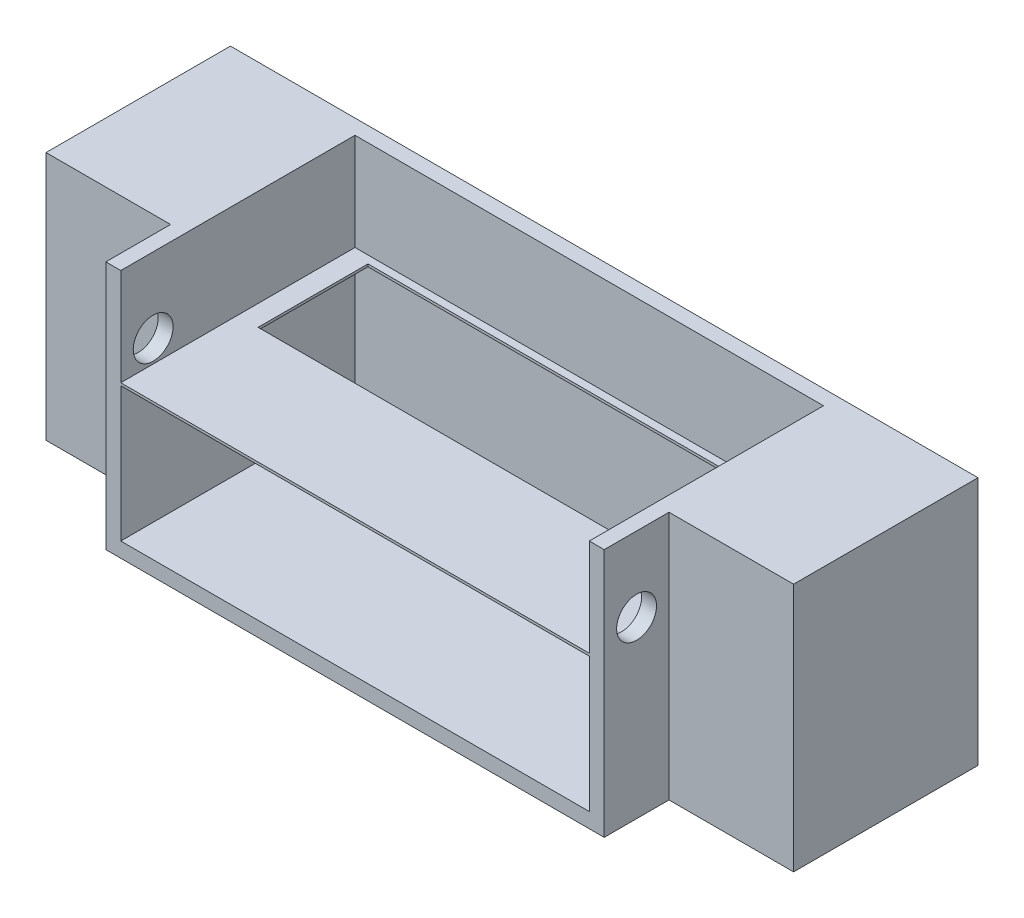
ISO-10303-21;
HEADER;
FILE_DESCRIPTION(('STEP AP214'),'2;1');
FILE_NAME('part.step','',(''),(''),'','','');
FILE_SCHEMA(('AUTOMOTIVE_DESIGN { 1 0 10303 214 1 1 1 1 }'));
ENDSEC;
DATA;
#1=APPLICATION_CONTEXT('core data for automotive mechanical design processes');
#2=APPLICATION_PROTOCOL_DEFINITION('international standard','automotive_design',2000,#1);
#3=PRODUCT_CONTEXT('',#1,'mechanical');
#4=PRODUCT('Part','Part','',(#3));
#5=PRODUCT_RELATED_PRODUCT_CATEGORY('part','',(#4));
#6=PRODUCT_DEFINITION_FORMATION('','',#4);
#7=PRODUCT_DEFINITION_CONTEXT('part definition',#1,'design');
#8=PRODUCT_DEFINITION('design','',#6,#7);
#9=PRODUCT_DEFINITION_SHAPE('','',#8);
#10=(LENGTH_UNIT() NAMED_UNIT(*) SI_UNIT(.MILLI.,.METRE.));
#11=(NAMED_UNIT(*) PLANE_ANGLE_UNIT() SI_UNIT($,.RADIAN.));
#12=(NAMED_UNIT(*) SI_UNIT($,.STERADIAN.) SOLID_ANGLE_UNIT());
#13=UNCERTAINTY_MEASURE_WITH_UNIT(LENGTH_MEASURE(1.E-05),#10,'distance_accuracy_value','');
#14=(GEOMETRIC_REPRESENTATION_CONTEXT(3) GLOBAL_UNCERTAINTY_ASSIGNED_CONTEXT((#13)) GLOBAL_UNIT_ASSIGNED_CONTEXT((#10,
#11,#12)) REPRESENTATION_CONTEXT('',''));
#15=CARTESIAN_POINT('',(0.,0.,0.));
#16=DIRECTION('',(0.,0.,1.));
#17=DIRECTION('',(1.,0.,0.));
#18=AXIS2_PLACEMENT_3D('',#15,#16,#17);
#19=CARTESIAN_POINT('',(-47.,-17.,0.));
#20=DIRECTION('',(-1.,0.,0.));
#21=DIRECTION('',(0.,-1.,0.));
#22=AXIS2_PLACEMENT_3D('',#19,#20,#21);
#23=PLANE('',#22);
#24=CARTESIAN_POINT('',(-47.,15.,-6.5));
#25=DIRECTION('',(-1.,0.,0.));
#26=DIRECTION('',(0.,-1.,0.));
#27=AXIS2_PLACEMENT_3D('',#24,#25,#26);
#28=CIRCLE('',#27,4.);
#29=CARTESIAN_POINT('',(-47.,11.,-6.5));
#30=VERTEX_POINT('',#29);
#31=EDGE_CURVE('E269',#30,#30,#28,.T.);
#32=ORIENTED_EDGE('',*,*,#31,.T.);
#33=EDGE_LOOP('',(#32));
#34=FACE_BOUND('',#33,.T.);
#35=DIRECTION('',(0.,1.,0.));
#36=VECTOR('',#35,1.);
#37=CARTESIAN_POINT('',(-47.,-17.,0.));
#38=LINE('',#37,#36);
#39=CARTESIAN_POINT('',(-47.,10.5,0.));
#40=VERTEX_POINT('',#39);
#41=CARTESIAN_POINT('',(-47.,30.,0.));
#42=VERTEX_POINT('',#41);
#43=EDGE_CURVE('E313',#40,#42,#38,.T.);
#44=ORIENTED_EDGE('',*,*,#43,.F.);
#45=DIRECTION('',(0.,0.,1.));
#46=VECTOR('',#45,1.);
#47=CARTESIAN_POINT('',(-47.,10.5,-500000.));
#48=LINE('',#47,#46);
#49=CARTESIAN_POINT('',(-47.,10.5,-47.));
#50=VERTEX_POINT('',#49);
#51=EDGE_CURVE('E213',#50,#40,#48,.T.);
#52=ORIENTED_EDGE('',*,*,#51,.F.);
#53=DIRECTION('',(0.,1.,0.));
#54=VECTOR('',#53,1.);
#55=CARTESIAN_POINT('',(-47.,-17.,-47.));
#56=LINE('',#55,#54);
#57=CARTESIAN_POINT('',(-47.,30.,-47.));
#58=VERTEX_POINT('',#57);
#59=EDGE_CURVE('E318',#50,#58,#56,.T.);
#60=ORIENTED_EDGE('',*,*,#59,.T.);
#61=DIRECTION('',(0.,0.,-1.));
#62=VECTOR('',#61,1.);
#63=CARTESIAN_POINT('',(-47.,30.,0.));
#64=LINE('',#63,#62);
#65=EDGE_CURVE('E233',#42,#58,#64,.T.);
#66=ORIENTED_EDGE('',*,*,#65,.F.);
#67=EDGE_LOOP('',(#44,#52,#60,#66));
#68=FACE_BOUND('',#67,.T.);
#69=ADVANCED_FACE('F33',(#34,#68),#23,.F.);
#70=CARTESIAN_POINT('',(47.,-17.,-47.));
#71=DIRECTION('',(0.,0.,-1.));
#72=DIRECTION('',(-1.,0.,0.));
#73=AXIS2_PLACEMENT_3D('',#70,#71,#72);
#74=PLANE('',#73);
#75=ORIENTED_EDGE('',*,*,#59,.F.);
#76=DIRECTION('',(-1.,0.,0.));
#77=VECTOR('',#76,1.);
#78=CARTESIAN_POINT('',(47.0000000000738,10.5,-47.0000000000255));
#79=LINE('',#78,#77);
#80=CARTESIAN_POINT('',(47.,10.5,-47.));
#81=VERTEX_POINT('',#80);
#82=EDGE_CURVE('E216',#81,#50,#79,.T.);
#83=ORIENTED_EDGE('',*,*,#82,.F.);
#84=DIRECTION('',(0.,1.,0.));
#85=VECTOR('',#84,1.);
#86=CARTESIAN_POINT('',(47.,-17.,-47.));
#87=LINE('',#86,#85);
#88=CARTESIAN_POINT('',(47.,30.,-47.));
#89=VERTEX_POINT('',#88);
#90=EDGE_CURVE('E322',#81,#89,#87,.T.);
#91=ORIENTED_EDGE('',*,*,#90,.T.);
#92=DIRECTION('',(1.,0.,0.));
#93=VECTOR('',#92,1.);
#94=CARTESIAN_POINT('',(-47.,30.,-47.));
#95=LINE('',#94,#93);
#96=EDGE_CURVE('E236',#58,#89,#95,.T.);
#97=ORIENTED_EDGE('',*,*,#96,.F.);
#98=EDGE_LOOP('',(#75,#83,#91,#97));
#99=FACE_BOUND('',#98,.T.);
#100=ADVANCED_FACE('F385',(#99),#74,.F.);
#101=CARTESIAN_POINT('',(47.,-17.,0.));
#102=DIRECTION('',(1.,0.,0.));
#103=DIRECTION('',(0.,1.,0.));
#104=AXIS2_PLACEMENT_3D('',#101,#102,#103);
#105=PLANE('',#104);
#106=CARTESIAN_POINT('',(47.,15.,-6.5));
#107=DIRECTION('',(1.,0.,0.));
#108=DIRECTION('',(0.,1.,0.));
#109=AXIS2_PLACEMENT_3D('',#106,#107,#108);
#110=CIRCLE('',#109,4.);
#111=CARTESIAN_POINT('',(47.,19.,-6.5));
#112=VERTEX_POINT('',#111);
#113=EDGE_CURVE('E37',#112,#112,#110,.T.);
#114=ORIENTED_EDGE('',*,*,#113,.T.);
#115=EDGE_LOOP('',(#114));
#116=FACE_BOUND('',#115,.T.);
#117=ORIENTED_EDGE('',*,*,#90,.F.);
#118=DIRECTION('',(0.,0.,1.));
#119=VECTOR('',#118,1.);
#120=CARTESIAN_POINT('',(47.,10.5,-500000.));
#121=LINE('',#120,#119);
#122=CARTESIAN_POINT('',(47.,10.5,0.));
#123=VERTEX_POINT('',#122);
#124=EDGE_CURVE('E220',#81,#123,#121,.T.);
#125=ORIENTED_EDGE('',*,*,#124,.T.);
#126=DIRECTION('',(0.,1.,0.));
#127=VECTOR('',#126,1.);
#128=CARTESIAN_POINT('',(47.,-17.,0.));
#129=LINE('',#128,#127);
#130=CARTESIAN_POINT('',(47.,30.,0.));
#131=VERTEX_POINT('',#130);
#132=EDGE_CURVE('E325',#123,#131,#129,.T.);
#133=ORIENTED_EDGE('',*,*,#132,.T.);
#134=DIRECTION('',(0.,0.,1.));
#135=VECTOR('',#134,1.);
#136=CARTESIAN_POINT('',(47.,30.,-47.));
#137=LINE('',#136,#135);
#138=EDGE_CURVE('E239',#89,#131,#137,.T.);
#139=ORIENTED_EDGE('',*,*,#138,.F.);
#140=EDGE_LOOP('',(#117,#125,#133,#139));
#141=FACE_BOUND('',#140,.T.);
#142=ADVANCED_FACE('F379',(#116,#141),#105,.F.);
#143=CARTESIAN_POINT('',(-50.,-20.,-50.));
#144=DIRECTION('',(-1.,0.,0.));
#145=DIRECTION('',(0.,0.,1.));
#146=AXIS2_PLACEMENT_3D('',#143,#144,#145);
#147=PLANE('',#146);
#148=CARTESIAN_POINT('',(-50.,15.,-6.5));
#149=DIRECTION('',(-1.,0.,0.));
#150=DIRECTION('',(0.,0.,1.));
#151=AXIS2_PLACEMENT_3D('',#148,#149,#150);
#152=CIRCLE('',#151,4.);
#153=CARTESIAN_POINT('',(-50.,15.,-2.5));
#154=VERTEX_POINT('',#153);
#155=EDGE_CURVE('E266',#154,#154,#152,.T.);
#156=ORIENTED_EDGE('',*,*,#155,.F.);
#157=EDGE_LOOP('',(#156));
#158=FACE_BOUND('',#157,.T.);
#159=DIRECTION('',(0.,-1.,0.));
#160=VECTOR('',#159,1.);
#161=CARTESIAN_POINT('',(-50.,-20.,0.));
#162=LINE('',#161,#160);
#163=CARTESIAN_POINT('',(-50.,30.,0.));
#164=VERTEX_POINT('',#163);
#165=CARTESIAN_POINT('',(-50.,-20.,0.));
#166=VERTEX_POINT('',#165);
#167=EDGE_CURVE('E317',#164,#166,#162,.T.);
#168=ORIENTED_EDGE('',*,*,#167,.F.);
#169=DIRECTION('',(0.,0.,1.));
#170=VECTOR('',#169,1.);
#171=CARTESIAN_POINT('',(-50.,30.,-13.));
#172=LINE('',#171,#170);
#173=CARTESIAN_POINT('',(-50.,30.,-13.));
#174=VERTEX_POINT('',#173);
#175=EDGE_CURVE('E263',#174,#164,#172,.T.);
#176=ORIENTED_EDGE('',*,*,#175,.F.);
#177=DIRECTION('',(0.,-1.,0.));
#178=VECTOR('',#177,1.);
#179=CARTESIAN_POINT('',(-50.,-20.,-13.));
#180=LINE('',#179,#178);
#181=CARTESIAN_POINT('',(-50.,-20.,-13.));
#182=VERTEX_POINT('',#181);
#183=EDGE_CURVE('E275',#174,#182,#180,.T.);
#184=ORIENTED_EDGE('',*,*,#183,.T.);
#185=DIRECTION('',(0.,0.,1.));
#186=VECTOR('',#185,1.);
#187=CARTESIAN_POINT('',(-50.,-20.,-50.));
#188=LINE('',#187,#186);
#189=EDGE_CURVE('E42',#182,#166,#188,.T.);
#190=ORIENTED_EDGE('',*,*,#189,.T.);
#191=EDGE_LOOP('',(#168,#176,#184,#190));
#192=FACE_BOUND('',#191,.T.);
#193=ADVANCED_FACE('F35',(#158,#192),#147,.T.);
#194=CARTESIAN_POINT('',(50.,-20.,-50.));
#195=DIRECTION('',(1.,0.,0.));
#196=DIRECTION('',(0.,0.,-1.));
#197=AXIS2_PLACEMENT_3D('',#194,#195,#196);
#198=PLANE('',#197);
#199=CARTESIAN_POINT('',(50.,15.,-6.5));
#200=DIRECTION('',(1.,0.,0.));
#201=DIRECTION('',(0.,0.,-1.));
#202=AXIS2_PLACEMENT_3D('',#199,#200,#201);
#203=CIRCLE('',#202,4.);
#204=CARTESIAN_POINT('',(50.,15.,-10.5));
#205=VERTEX_POINT('',#204);
#206=EDGE_CURVE('E272',#205,#205,#203,.T.);
#207=ORIENTED_EDGE('',*,*,#206,.F.);
#208=EDGE_LOOP('',(#207));
#209=FACE_BOUND('',#208,.T.);
#210=DIRECTION('',(0.,-1.,0.));
#211=VECTOR('',#210,1.);
#212=CARTESIAN_POINT('',(50.,-20.,-13.));
#213=LINE('',#212,#211);
#214=CARTESIAN_POINT('',(50.,30.,-13.));
#215=VERTEX_POINT('',#214);
#216=CARTESIAN_POINT('',(50.,-20.,-13.));
#217=VERTEX_POINT('',#216);
#218=EDGE_CURVE('E288',#215,#217,#213,.T.);
#219=ORIENTED_EDGE('',*,*,#218,.F.);
#220=DIRECTION('',(0.,0.,-1.));
#221=VECTOR('',#220,1.);
#222=CARTESIAN_POINT('',(50.,30.,0.));
#223=LINE('',#222,#221);
#224=CARTESIAN_POINT('',(50.,30.,0.));
#225=VERTEX_POINT('',#224);
#226=EDGE_CURVE('E245',#225,#215,#223,.T.);
#227=ORIENTED_EDGE('',*,*,#226,.F.);
#228=DIRECTION('',(0.,1.,0.));
#229=VECTOR('',#228,1.);
#230=CARTESIAN_POINT('',(50.,-20.,0.));
#231=LINE('',#230,#229);
#232=CARTESIAN_POINT('',(50.,-20.,0.));
#233=VERTEX_POINT('',#232);
#234=EDGE_CURVE('E331',#233,#225,#231,.T.);
#235=ORIENTED_EDGE('',*,*,#234,.F.);
#236=DIRECTION('',(0.,0.,1.));
#237=VECTOR('',#236,1.);
#238=CARTESIAN_POINT('',(50.,-20.,-50.));
#239=LINE('',#238,#237);
#240=EDGE_CURVE('E11',#217,#233,#239,.T.);
#241=ORIENTED_EDGE('',*,*,#240,.F.);
#242=EDGE_LOOP('',(#219,#227,#235,#241));
#243=FACE_BOUND('',#242,.T.);
#244=ADVANCED_FACE('F372',(#209,#243),#198,.T.);
#245=CARTESIAN_POINT('',(50.,-20.,-50.));
#246=DIRECTION('',(0.,-1.,0.));
#247=DIRECTION('',(1.,0.,0.));
#248=AXIS2_PLACEMENT_3D('',#245,#246,#247);
#249=PLANE('',#248);
#250=DIRECTION('',(1.,0.,0.));
#251=VECTOR('',#250,1.);
#252=CARTESIAN_POINT('',(50.,-20.,0.));
#253=LINE('',#252,#251);
#254=EDGE_CURVE('E334',#166,#233,#253,.T.);
#255=ORIENTED_EDGE('',*,*,#254,.F.);
#256=ORIENTED_EDGE('',*,*,#189,.F.);
#257=DIRECTION('',(1.,0.,0.));
#258=VECTOR('',#257,1.);
#259=CARTESIAN_POINT('',(-75.,-20.,-13.));
#260=LINE('',#259,#258);
#261=CARTESIAN_POINT('',(-75.,-20.,-13.));
#262=VERTEX_POINT('',#261);
#263=EDGE_CURVE('E284',#262,#182,#260,.T.);
#264=ORIENTED_EDGE('',*,*,#263,.F.);
#265=DIRECTION('',(0.,0.,-1.));
#266=VECTOR('',#265,1.);
#267=CARTESIAN_POINT('',(-75.,-20.,-50.));
#268=LINE('',#267,#266);
#269=CARTESIAN_POINT('',(-75.,-20.,-50.));
#270=VERTEX_POINT('',#269);
#271=EDGE_CURVE('E281',#262,#270,#268,.T.);
#272=ORIENTED_EDGE('',*,*,#271,.T.);
#273=DIRECTION('',(1.,0.,0.));
#274=VECTOR('',#273,1.);
#275=CARTESIAN_POINT('',(50.,-20.,-50.));
#276=LINE('',#275,#274);
#277=CARTESIAN_POINT('',(75.,-20.,-50.));
#278=VERTEX_POINT('',#277);
#279=EDGE_CURVE('E329',#270,#278,#276,.T.);
#280=ORIENTED_EDGE('',*,*,#279,.T.);
#281=DIRECTION('',(0.,0.,-1.));
#282=VECTOR('',#281,1.);
#283=CARTESIAN_POINT('',(75.,-20.,-50.));
#284=LINE('',#283,#282);
#285=CARTESIAN_POINT('',(75.,-20.,-13.));
#286=VERTEX_POINT('',#285);
#287=EDGE_CURVE('E292',#286,#278,#284,.T.);
#288=ORIENTED_EDGE('',*,*,#287,.F.);
#289=DIRECTION('',(-1.,0.,0.));
#290=VECTOR('',#289,1.);
#291=CARTESIAN_POINT('',(75.,-20.,-13.));
#292=LINE('',#291,#290);
#293=EDGE_CURVE('E297',#286,#217,#292,.T.);
#294=ORIENTED_EDGE('',*,*,#293,.T.);
#295=ORIENTED_EDGE('',*,*,#240,.T.);
#296=EDGE_LOOP('',(#255,#256,#264,#272,#280,#288,#294,#295));
#297=FACE_BOUND('',#296,.T.);
#298=ADVANCED_FACE('F342',(#297),#249,.T.);
#299=CARTESIAN_POINT('',(0.,0.,-50.));
#300=DIRECTION('',(0.,0.,1.));
#301=DIRECTION('',(1.,0.,0.));
#302=AXIS2_PLACEMENT_3D('',#299,#300,#301);
#303=PLANE('',#302);
#304=ORIENTED_EDGE('',*,*,#279,.F.);
#305=DIRECTION('',(0.,1.,0.));
#306=VECTOR('',#305,1.);
#307=CARTESIAN_POINT('',(-75.,-20.,-50.));
#308=LINE('',#307,#306);
#309=CARTESIAN_POINT('',(-75.,30.,-50.));
#310=VERTEX_POINT('',#309);
#311=EDGE_CURVE('E279',#270,#310,#308,.T.);
#312=ORIENTED_EDGE('',*,*,#311,.T.);
#313=DIRECTION('',(-1.,0.,0.));
#314=VECTOR('',#313,1.);
#315=CARTESIAN_POINT('',(75.,30.,-50.));
#316=LINE('',#315,#314);
#317=CARTESIAN_POINT('',(75.,30.,-50.));
#318=VERTEX_POINT('',#317);
#319=EDGE_CURVE('E254',#318,#310,#316,.T.);
#320=ORIENTED_EDGE('',*,*,#319,.F.);
#321=DIRECTION('',(0.,1.,0.));
#322=VECTOR('',#321,1.);
#323=CARTESIAN_POINT('',(75.,-20.,-50.));
#324=LINE('',#323,#322);
#325=EDGE_CURVE('E295',#278,#318,#324,.T.);
#326=ORIENTED_EDGE('',*,*,#325,.F.);
#327=EDGE_LOOP('',(#304,#312,#320,#326));
#328=FACE_BOUND('',#327,.T.);
#329=ADVANCED_FACE('F361',(#328),#303,.F.);
#330=CARTESIAN_POINT('',(0.,0.,0.));
#331=DIRECTION('',(0.,0.,1.));
#332=DIRECTION('',(1.,0.,0.));
#333=AXIS2_PLACEMENT_3D('',#330,#331,#332);
#334=PLANE('',#333);
#335=CARTESIAN_POINT('',(-47.,-17.,0.));
#336=VERTEX_POINT('',#335);
#337=CARTESIAN_POINT('',(-47.,9.99999999999998,0.));
#338=VERTEX_POINT('',#337);
#339=EDGE_CURVE('E326',#336,#338,#38,.T.);
#340=ORIENTED_EDGE('',*,*,#339,.T.);
#341=DIRECTION('',(1.,0.,0.));
#342=VECTOR('',#341,1.);
#343=CARTESIAN_POINT('',(47.,9.99999999999999,0.));
#344=LINE('',#343,#342);
#345=CARTESIAN_POINT('',(47.,9.99999999999998,0.));
#346=VERTEX_POINT('',#345);
#347=EDGE_CURVE('E210',#338,#346,#344,.T.);
#348=ORIENTED_EDGE('',*,*,#347,.T.);
#349=CARTESIAN_POINT('',(47.,-17.,0.));
#350=VERTEX_POINT('',#349);
#351=EDGE_CURVE('E323',#350,#346,#129,.T.);
#352=ORIENTED_EDGE('',*,*,#351,.F.);
#353=DIRECTION('',(1.,0.,0.));
#354=VECTOR('',#353,1.);
#355=CARTESIAN_POINT('',(47.,-17.,0.));
#356=LINE('',#355,#354);
#357=EDGE_CURVE('E304',#336,#350,#356,.T.);
#358=ORIENTED_EDGE('',*,*,#357,.F.);
#359=EDGE_LOOP('',(#340,#348,#352,#358));
#360=FACE_BOUND('',#359,.T.);
#361=DIRECTION('',(-1.,0.,0.));
#362=VECTOR('',#361,1.);
#363=CARTESIAN_POINT('',(47.,10.5,0.));
#364=LINE('',#363,#362);
#365=EDGE_CURVE('E207',#123,#40,#364,.T.);
#366=ORIENTED_EDGE('',*,*,#365,.T.);
#367=ORIENTED_EDGE('',*,*,#43,.T.);
#368=DIRECTION('',(1.,0.,0.));
#369=VECTOR('',#368,1.);
#370=CARTESIAN_POINT('',(-50.,30.,0.));
#371=LINE('',#370,#369);
#372=EDGE_CURVE('E230',#164,#42,#371,.T.);
#373=ORIENTED_EDGE('',*,*,#372,.F.);
#374=ORIENTED_EDGE('',*,*,#167,.T.);
#375=ORIENTED_EDGE('',*,*,#254,.T.);
#376=ORIENTED_EDGE('',*,*,#234,.T.);
#377=DIRECTION('',(1.,0.,0.));
#378=VECTOR('',#377,1.);
#379=CARTESIAN_POINT('',(47.,30.,0.));
#380=LINE('',#379,#378);
#381=EDGE_CURVE('E242',#131,#225,#380,.T.);
#382=ORIENTED_EDGE('',*,*,#381,.F.);
#383=ORIENTED_EDGE('',*,*,#132,.F.);
#384=EDGE_LOOP('',(#366,#367,#373,#374,#375,#376,#382,#383));
#385=FACE_BOUND('',#384,.T.);
#386=ADVANCED_FACE('F346',(#360,#385),#334,.T.);
#387=CARTESIAN_POINT('',(-47.,-17.,-47.));
#388=VERTEX_POINT('',#387);
#389=CARTESIAN_POINT('',(-47.,9.99999999999998,-47.));
#390=VERTEX_POINT('',#389);
#391=EDGE_CURVE('E314',#388,#390,#56,.T.);
#392=ORIENTED_EDGE('',*,*,#391,.T.);
#393=DIRECTION('',(0.,0.,1.));
#394=VECTOR('',#393,1.);
#395=CARTESIAN_POINT('',(-47.,9.99999999999998,-500000.));
#396=LINE('',#395,#394);
#397=EDGE_CURVE('E214',#390,#338,#396,.T.);
#398=ORIENTED_EDGE('',*,*,#397,.T.);
#399=ORIENTED_EDGE('',*,*,#339,.F.);
#400=DIRECTION('',(0.,0.,1.));
#401=VECTOR('',#400,1.);
#402=CARTESIAN_POINT('',(-47.,-17.,0.));
#403=LINE('',#402,#401);
#404=EDGE_CURVE('E302',#388,#336,#403,.T.);
#405=ORIENTED_EDGE('',*,*,#404,.F.);
#406=EDGE_LOOP('',(#392,#398,#399,#405));
#407=FACE_BOUND('',#406,.T.);
#408=ADVANCED_FACE('F398',(#407),#23,.F.);
#409=CARTESIAN_POINT('',(47.,-17.,-47.));
#410=VERTEX_POINT('',#409);
#411=CARTESIAN_POINT('',(47.,9.99999999999999,-47.));
#412=VERTEX_POINT('',#411);
#413=EDGE_CURVE('E319',#410,#412,#87,.T.);
#414=ORIENTED_EDGE('',*,*,#413,.T.);
#415=DIRECTION('',(1.,0.,0.));
#416=VECTOR('',#415,1.);
#417=CARTESIAN_POINT('',(47.0000000000738,9.99999999999999,-47.0000000000255));
#418=LINE('',#417,#416);
#419=EDGE_CURVE('E227',#390,#412,#418,.T.);
#420=ORIENTED_EDGE('',*,*,#419,.F.);
#421=ORIENTED_EDGE('',*,*,#391,.F.);
#422=DIRECTION('',(-1.,0.,0.));
#423=VECTOR('',#422,1.);
#424=CARTESIAN_POINT('',(47.,-17.,-47.));
#425=LINE('',#424,#423);
#426=EDGE_CURVE('E310',#410,#388,#425,.T.);
#427=ORIENTED_EDGE('',*,*,#426,.F.);
#428=EDGE_LOOP('',(#414,#420,#421,#427));
#429=FACE_BOUND('',#428,.T.);
#430=ADVANCED_FACE('F388',(#429),#74,.F.);
#431=ORIENTED_EDGE('',*,*,#351,.T.);
#432=DIRECTION('',(0.,0.,1.));
#433=VECTOR('',#432,1.);
#434=CARTESIAN_POINT('',(47.,9.99999999999999,-500000.));
#435=LINE('',#434,#433);
#436=EDGE_CURVE('E217',#412,#346,#435,.T.);
#437=ORIENTED_EDGE('',*,*,#436,.F.);
#438=ORIENTED_EDGE('',*,*,#413,.F.);
#439=DIRECTION('',(0.,0.,-1.));
#440=VECTOR('',#439,1.);
#441=CARTESIAN_POINT('',(47.,-17.,0.));
#442=LINE('',#441,#440);
#443=EDGE_CURVE('E307',#350,#410,#442,.T.);
#444=ORIENTED_EDGE('',*,*,#443,.F.);
#445=EDGE_LOOP('',(#431,#437,#438,#444));
#446=FACE_BOUND('',#445,.T.);
#447=ADVANCED_FACE('F395',(#446),#105,.F.);
#448=CARTESIAN_POINT('',(0.,-17.,0.));
#449=DIRECTION('',(0.,1.,0.));
#450=DIRECTION('',(-1.,0.,0.));
#451=AXIS2_PLACEMENT_3D('',#448,#449,#450);
#452=PLANE('',#451);
#453=ORIENTED_EDGE('',*,*,#404,.T.);
#454=ORIENTED_EDGE('',*,*,#357,.T.);
#455=ORIENTED_EDGE('',*,*,#443,.T.);
#456=ORIENTED_EDGE('',*,*,#426,.T.);
#457=EDGE_LOOP('',(#453,#454,#455,#456));
#458=FACE_BOUND('',#457,.T.);
#459=ADVANCED_FACE('F406',(#458),#452,.T.);
#460=CARTESIAN_POINT('',(75.,-20.,-13.));
#461=DIRECTION('',(0.,0.,-1.));
#462=DIRECTION('',(-1.,0.,0.));
#463=AXIS2_PLACEMENT_3D('',#460,#461,#462);
#464=PLANE('',#463);
#465=ORIENTED_EDGE('',*,*,#218,.T.);
#466=ORIENTED_EDGE('',*,*,#293,.F.);
#467=DIRECTION('',(0.,-1.,0.));
#468=VECTOR('',#467,1.);
#469=CARTESIAN_POINT('',(75.,-20.,-13.));
#470=LINE('',#469,#468);
#471=CARTESIAN_POINT('',(75.,30.,-13.));
#472=VERTEX_POINT('',#471);
#473=EDGE_CURVE('E289',#472,#286,#470,.T.);
#474=ORIENTED_EDGE('',*,*,#473,.F.);
#475=DIRECTION('',(1.,0.,0.));
#476=VECTOR('',#475,1.);
#477=CARTESIAN_POINT('',(50.,30.,-13.));
#478=LINE('',#477,#476);
#479=EDGE_CURVE('E248',#215,#472,#478,.T.);
#480=ORIENTED_EDGE('',*,*,#479,.F.);
#481=EDGE_LOOP('',(#465,#466,#474,#480));
#482=FACE_BOUND('',#481,.T.);
#483=ADVANCED_FACE('F369',(#482),#464,.F.);
#484=CARTESIAN_POINT('',(75.,0.,0.));
#485=DIRECTION('',(1.,0.,0.));
#486=DIRECTION('',(0.,0.,-1.));
#487=AXIS2_PLACEMENT_3D('',#484,#485,#486);
#488=PLANE('',#487);
#489=ORIENTED_EDGE('',*,*,#473,.T.);
#490=ORIENTED_EDGE('',*,*,#287,.T.);
#491=ORIENTED_EDGE('',*,*,#325,.T.);
#492=DIRECTION('',(0.,0.,-1.));
#493=VECTOR('',#492,1.);
#494=CARTESIAN_POINT('',(75.,30.,-13.));
#495=LINE('',#494,#493);
#496=EDGE_CURVE('E251',#472,#318,#495,.T.);
#497=ORIENTED_EDGE('',*,*,#496,.F.);
#498=EDGE_LOOP('',(#489,#490,#491,#497));
#499=FACE_BOUND('',#498,.T.);
#500=ADVANCED_FACE('F366',(#499),#488,.T.);
#501=CARTESIAN_POINT('',(-75.,-20.,-13.));
#502=DIRECTION('',(0.,0.,1.));
#503=DIRECTION('',(1.,0.,0.));
#504=AXIS2_PLACEMENT_3D('',#501,#502,#503);
#505=PLANE('',#504);
#506=ORIENTED_EDGE('',*,*,#183,.F.);
#507=DIRECTION('',(1.,0.,0.));
#508=VECTOR('',#507,1.);
#509=CARTESIAN_POINT('',(-75.,30.,-13.));
#510=LINE('',#509,#508);
#511=CARTESIAN_POINT('',(-75.,30.,-13.));
#512=VERTEX_POINT('',#511);
#513=EDGE_CURVE('E260',#512,#174,#510,.T.);
#514=ORIENTED_EDGE('',*,*,#513,.F.);
#515=DIRECTION('',(0.,-1.,0.));
#516=VECTOR('',#515,1.);
#517=CARTESIAN_POINT('',(-75.,-20.,-13.));
#518=LINE('',#517,#516);
#519=EDGE_CURVE('E276',#512,#262,#518,.T.);
#520=ORIENTED_EDGE('',*,*,#519,.T.);
#521=ORIENTED_EDGE('',*,*,#263,.T.);
#522=EDGE_LOOP('',(#506,#514,#520,#521));
#523=FACE_BOUND('',#522,.T.);
#524=ADVANCED_FACE('F354',(#523),#505,.T.);
#525=CARTESIAN_POINT('',(-75.,0.,0.));
#526=DIRECTION('',(-1.,0.,0.));
#527=DIRECTION('',(0.,0.,-1.));
#528=AXIS2_PLACEMENT_3D('',#525,#526,#527);
#529=PLANE('',#528);
#530=ORIENTED_EDGE('',*,*,#519,.F.);
#531=DIRECTION('',(0.,0.,1.));
#532=VECTOR('',#531,1.);
#533=CARTESIAN_POINT('',(-75.,30.,-50.));
#534=LINE('',#533,#532);
#535=EDGE_CURVE('E257',#310,#512,#534,.T.);
#536=ORIENTED_EDGE('',*,*,#535,.F.);
#537=ORIENTED_EDGE('',*,*,#311,.F.);
#538=ORIENTED_EDGE('',*,*,#271,.F.);
#539=EDGE_LOOP('',(#530,#536,#537,#538));
#540=FACE_BOUND('',#539,.T.);
#541=ADVANCED_FACE('F358',(#540),#529,.T.);
#542=CARTESIAN_POINT('',(75.,15.,-6.5));
#543=DIRECTION('',(-1.,0.,0.));
#544=DIRECTION('',(0.,0.,1.));
#545=AXIS2_PLACEMENT_3D('',#542,#543,#544);
#546=CYLINDRICAL_SURFACE('',#545,4.);
#547=ORIENTED_EDGE('',*,*,#206,.T.);
#548=EDGE_LOOP('',(#547));
#549=FACE_BOUND('',#548,.T.);
#550=ORIENTED_EDGE('',*,*,#113,.F.);
#551=EDGE_LOOP('',(#550));
#552=FACE_BOUND('',#551,.T.);
#553=ADVANCED_FACE('F431',(#549,#552),#546,.F.);
#554=ORIENTED_EDGE('',*,*,#155,.T.);
#555=EDGE_LOOP('',(#554));
#556=FACE_BOUND('',#555,.T.);
#557=ORIENTED_EDGE('',*,*,#31,.F.);
#558=EDGE_LOOP('',(#557));
#559=FACE_BOUND('',#558,.T.);
#560=ADVANCED_FACE('F432',(#556,#559),#546,.F.);
#561=CARTESIAN_POINT('',(0.,30.,0.));
#562=DIRECTION('',(0.,1.,0.));
#563=DIRECTION('',(0.,0.,1.));
#564=AXIS2_PLACEMENT_3D('',#561,#562,#563);
#565=PLANE('',#564);
#566=ORIENTED_EDGE('',*,*,#372,.T.);
#567=ORIENTED_EDGE('',*,*,#65,.T.);
#568=ORIENTED_EDGE('',*,*,#96,.T.);
#569=ORIENTED_EDGE('',*,*,#138,.T.);
#570=ORIENTED_EDGE('',*,*,#381,.T.);
#571=ORIENTED_EDGE('',*,*,#226,.T.);
#572=ORIENTED_EDGE('',*,*,#479,.T.);
#573=ORIENTED_EDGE('',*,*,#496,.T.);
#574=ORIENTED_EDGE('',*,*,#319,.T.);
#575=ORIENTED_EDGE('',*,*,#535,.T.);
#576=ORIENTED_EDGE('',*,*,#513,.T.);
#577=ORIENTED_EDGE('',*,*,#175,.T.);
#578=EDGE_LOOP('',(#566,#567,#568,#569,#570,#571,#572,#573,#574,#575,#576,#577));
#579=FACE_BOUND('',#578,.T.);
#580=ADVANCED_FACE('F349',(#579),#565,.T.);
#581=CARTESIAN_POINT('',(47.,10.5,-500000.));
#582=DIRECTION('',(0.,1.,0.));
#583=DIRECTION('',(-1.,0.,0.));
#584=AXIS2_PLACEMENT_3D('',#581,#582,#583);
#585=PLANE('',#584);
#586=DIRECTION('',(1.,0.,0.));
#587=VECTOR('',#586,1.);
#588=CARTESIAN_POINT('',(42.8499408613701,10.5,-23.4113905322262));
#589=LINE('',#588,#587);
#590=CARTESIAN_POINT('',(-42.8499408613701,10.5,-23.4113905322262));
#591=VERTEX_POINT('',#590);
#592=CARTESIAN_POINT('',(42.8499408613701,10.5,-23.4113905322262));
#593=VERTEX_POINT('',#592);
#594=EDGE_CURVE('E198',#591,#593,#589,.T.);
#595=ORIENTED_EDGE('',*,*,#594,.F.);
#596=DIRECTION('',(0.,0.,1.));
#597=VECTOR('',#596,1.);
#598=CARTESIAN_POINT('',(-42.8499408613701,10.5,-23.4113905322262));
#599=LINE('',#598,#597);
#600=CARTESIAN_POINT('',(-42.8499408613701,10.5,-45.4517565673882));
#601=VERTEX_POINT('',#600);
#602=EDGE_CURVE('E196',#601,#591,#599,.T.);
#603=ORIENTED_EDGE('',*,*,#602,.F.);
#604=DIRECTION('',(-1.,0.,0.));
#605=VECTOR('',#604,1.);
#606=CARTESIAN_POINT('',(42.8499408613701,10.5,-45.4517565673562));
#607=LINE('',#606,#605);
#608=CARTESIAN_POINT('',(42.8499408613701,10.5,-45.4517565673562));
#609=VERTEX_POINT('',#608);
#610=EDGE_CURVE('E50',#609,#601,#607,.T.);
#611=ORIENTED_EDGE('',*,*,#610,.F.);
#612=DIRECTION('',(0.,0.,-1.));
#613=VECTOR('',#612,1.);
#614=CARTESIAN_POINT('',(42.8499408613701,10.5,-23.4113905322262));
#615=LINE('',#614,#613);
#616=EDGE_CURVE('E186',#593,#609,#615,.T.);
#617=ORIENTED_EDGE('',*,*,#616,.F.);
#618=EDGE_LOOP('',(#595,#603,#611,#617));
#619=FACE_BOUND('',#618,.T.);
#620=ORIENTED_EDGE('',*,*,#124,.F.);
#621=ORIENTED_EDGE('',*,*,#82,.T.);
#622=ORIENTED_EDGE('',*,*,#51,.T.);
#623=ORIENTED_EDGE('',*,*,#365,.F.);
#624=EDGE_LOOP('',(#620,#621,#622,#623));
#625=FACE_BOUND('',#624,.T.);
#626=ADVANCED_FACE('F381',(#619,#625),#585,.T.);
#627=CARTESIAN_POINT('',(47.,9.99999999999999,-500000.));
#628=DIRECTION('',(0.,-1.,0.));
#629=DIRECTION('',(1.,0.,0.));
#630=AXIS2_PLACEMENT_3D('',#627,#628,#629);
#631=PLANE('',#630);
#632=DIRECTION('',(1.,0.,0.));
#633=VECTOR('',#632,1.);
#634=CARTESIAN_POINT('',(42.8499408613701,9.99999999999999,-23.4113905322262));
#635=LINE('',#634,#633);
#636=CARTESIAN_POINT('',(-42.8499408613701,9.99999999999998,-23.4113905322033));
#637=VERTEX_POINT('',#636);
#638=CARTESIAN_POINT('',(42.8499408613701,9.99999999999999,-23.4113905322262));
#639=VERTEX_POINT('',#638);
#640=EDGE_CURVE('E192',#637,#639,#635,.T.);
#641=ORIENTED_EDGE('',*,*,#640,.T.);
#642=DIRECTION('',(0.,0.,-1.));
#643=VECTOR('',#642,1.);
#644=CARTESIAN_POINT('',(42.8499408613701,9.99999999999999,-23.4113905322262));
#645=LINE('',#644,#643);
#646=CARTESIAN_POINT('',(42.8499408613701,9.99999999999999,-45.4517565673562));
#647=VERTEX_POINT('',#646);
#648=EDGE_CURVE('E180',#639,#647,#645,.T.);
#649=ORIENTED_EDGE('',*,*,#648,.T.);
#650=DIRECTION('',(-1.,0.,0.));
#651=VECTOR('',#650,1.);
#652=CARTESIAN_POINT('',(42.8499408613701,9.99999999999999,-45.4517565673562));
#653=LINE('',#652,#651);
#654=CARTESIAN_POINT('',(-42.8499408613701,9.99999999999998,-45.4517565673562));
#655=VERTEX_POINT('',#654);
#656=EDGE_CURVE('E170',#647,#655,#653,.T.);
#657=ORIENTED_EDGE('',*,*,#656,.T.);
#658=DIRECTION('',(0.,0.,1.));
#659=VECTOR('',#658,1.);
#660=CARTESIAN_POINT('',(-42.8499408613701,9.99999999999998,-23.4113905322262));
#661=LINE('',#660,#659);
#662=EDGE_CURVE('E179',#655,#637,#661,.T.);
#663=ORIENTED_EDGE('',*,*,#662,.T.);
#664=EDGE_LOOP('',(#641,#649,#657,#663));
#665=FACE_BOUND('',#664,.T.);
#666=ORIENTED_EDGE('',*,*,#397,.F.);
#667=ORIENTED_EDGE('',*,*,#419,.T.);
#668=ORIENTED_EDGE('',*,*,#436,.T.);
#669=ORIENTED_EDGE('',*,*,#347,.F.);
#670=EDGE_LOOP('',(#666,#667,#668,#669));
#671=FACE_BOUND('',#670,.T.);
#672=ADVANCED_FACE('F190',(#665,#671),#631,.T.);
#673=CARTESIAN_POINT('',(42.8499408613701,-20.001,-23.4113905322262));
#674=DIRECTION('',(0.,0.,1.));
#675=DIRECTION('',(1.,0.,0.));
#676=AXIS2_PLACEMENT_3D('',#673,#674,#675);
#677=PLANE('',#676);
#678=DIRECTION('',(0.,1.,0.));
#679=VECTOR('',#678,1.);
#680=CARTESIAN_POINT('',(-42.8499408613701,-20.001,-23.4113905322262));
#681=LINE('',#680,#679);
#682=EDGE_CURVE('E58',#637,#591,#681,.T.);
#683=ORIENTED_EDGE('',*,*,#682,.T.);
#684=ORIENTED_EDGE('',*,*,#594,.T.);
#685=DIRECTION('',(0.,1.,0.));
#686=VECTOR('',#685,1.);
#687=CARTESIAN_POINT('',(42.8499408613701,-20.001,-23.4113905322262));
#688=LINE('',#687,#686);
#689=EDGE_CURVE('E187',#639,#593,#688,.T.);
#690=ORIENTED_EDGE('',*,*,#689,.F.);
#691=ORIENTED_EDGE('',*,*,#640,.F.);
#692=EDGE_LOOP('',(#683,#684,#690,#691));
#693=FACE_BOUND('',#692,.T.);
#694=ADVANCED_FACE('F441',(#693),#677,.F.);
#695=CARTESIAN_POINT('',(42.8499408613701,-20.001,-23.4113905322262));
#696=DIRECTION('',(1.,0.,0.));
#697=DIRECTION('',(0.,1.,0.));
#698=AXIS2_PLACEMENT_3D('',#695,#696,#697);
#699=PLANE('',#698);
#700=ORIENTED_EDGE('',*,*,#689,.T.);
#701=ORIENTED_EDGE('',*,*,#616,.T.);
#702=DIRECTION('',(0.,1.,0.));
#703=VECTOR('',#702,1.);
#704=CARTESIAN_POINT('',(42.8499408613701,-20.001,-45.4517565673562));
#705=LINE('',#704,#703);
#706=EDGE_CURVE('E173',#647,#609,#705,.T.);
#707=ORIENTED_EDGE('',*,*,#706,.F.);
#708=ORIENTED_EDGE('',*,*,#648,.F.);
#709=EDGE_LOOP('',(#700,#701,#707,#708));
#710=FACE_BOUND('',#709,.T.);
#711=ADVANCED_FACE('F183',(#710),#699,.F.);
#712=CARTESIAN_POINT('',(42.8499408613701,-20.001,-45.4517565673562));
#713=DIRECTION('',(0.,0.,-1.));
#714=DIRECTION('',(-1.,0.,0.));
#715=AXIS2_PLACEMENT_3D('',#712,#713,#714);
#716=PLANE('',#715);
#717=ORIENTED_EDGE('',*,*,#706,.T.);
#718=ORIENTED_EDGE('',*,*,#610,.T.);
#719=DIRECTION('',(0.,1.,0.));
#720=VECTOR('',#719,1.);
#721=CARTESIAN_POINT('',(-42.8499408613701,-20.001,-45.4517565673562));
#722=LINE('',#721,#720);
#723=EDGE_CURVE('E175',#655,#601,#722,.T.);
#724=ORIENTED_EDGE('',*,*,#723,.F.);
#725=ORIENTED_EDGE('',*,*,#656,.F.);
#726=EDGE_LOOP('',(#717,#718,#724,#725));
#727=FACE_BOUND('',#726,.T.);
#728=ADVANCED_FACE('F172',(#727),#716,.F.);
#729=CARTESIAN_POINT('',(-42.8499408613701,-20.001,-23.4113905322262));
#730=DIRECTION('',(-1.,0.,0.));
#731=DIRECTION('',(0.,-1.,0.));
#732=AXIS2_PLACEMENT_3D('',#729,#730,#731);
#733=PLANE('',#732);
#734=ORIENTED_EDGE('',*,*,#723,.T.);
#735=ORIENTED_EDGE('',*,*,#602,.T.);
#736=ORIENTED_EDGE('',*,*,#682,.F.);
#737=ORIENTED_EDGE('',*,*,#662,.F.);
#738=EDGE_LOOP('',(#734,#735,#736,#737));
#739=FACE_BOUND('',#738,.T.);
#740=ADVANCED_FACE('F444',(#739),#733,.F.);
#741=CLOSED_SHELL('',(#69,#100,#142,#193,#244,#298,#329,#386,#408,#430,#447,#459,#483,#500,#524,
#541,#553,#560,#580,#626,#672,#694,#711,#728,#740));
#742=MANIFOLD_SOLID_BREP('B2',#741);
#743=ADVANCED_BREP_SHAPE_REPRESENTATION('',(#18,#742),#14);
#744=SHAPE_DEFINITION_REPRESENTATION(#9,#743);
ENDSEC;
END-ISO-10303-21;
